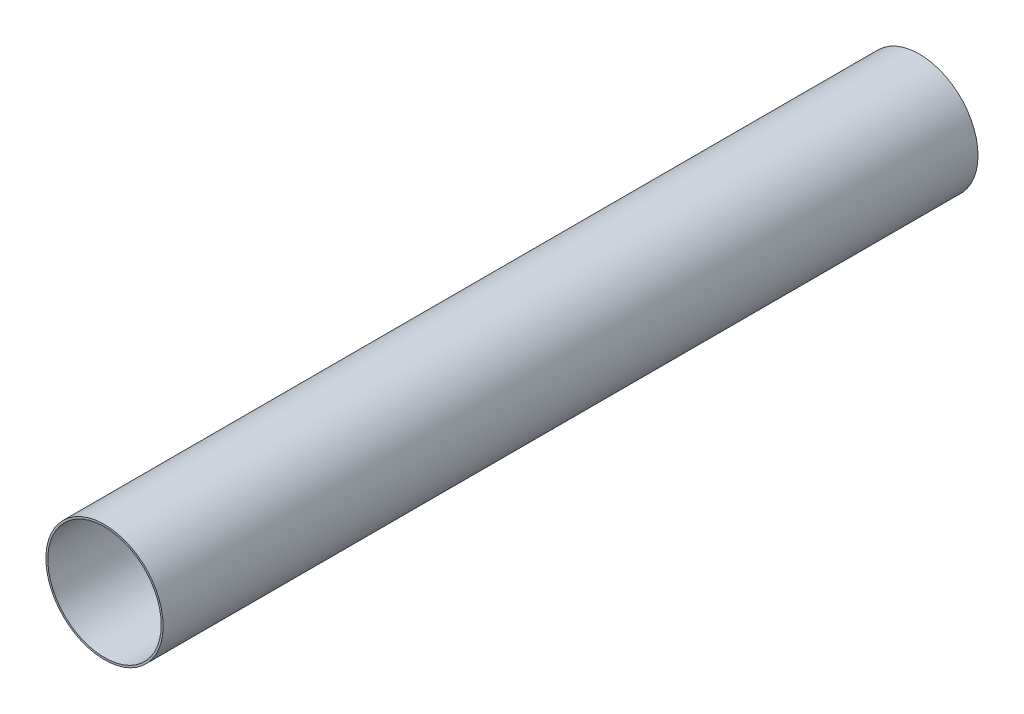
ISO-10303-21;
HEADER;
FILE_DESCRIPTION(('STEP AP214'),'2;1');
FILE_NAME('part.step','',(''),(''),'','','');
FILE_SCHEMA(('AUTOMOTIVE_DESIGN { 1 0 10303 214 1 1 1 1 }'));
ENDSEC;
DATA;
#1=APPLICATION_CONTEXT('core data for automotive mechanical design processes');
#2=APPLICATION_PROTOCOL_DEFINITION('international standard','automotive_design',2000,#1);
#3=PRODUCT_CONTEXT('',#1,'mechanical');
#4=PRODUCT('Part','Part','',(#3));
#5=PRODUCT_RELATED_PRODUCT_CATEGORY('part','',(#4));
#6=PRODUCT_DEFINITION_FORMATION('','',#4);
#7=PRODUCT_DEFINITION_CONTEXT('part definition',#1,'design');
#8=PRODUCT_DEFINITION('design','',#6,#7);
#9=PRODUCT_DEFINITION_SHAPE('','',#8);
#10=(LENGTH_UNIT() NAMED_UNIT(*) SI_UNIT(.MILLI.,.METRE.));
#11=(NAMED_UNIT(*) PLANE_ANGLE_UNIT() SI_UNIT($,.RADIAN.));
#12=(NAMED_UNIT(*) SI_UNIT($,.STERADIAN.) SOLID_ANGLE_UNIT());
#13=UNCERTAINTY_MEASURE_WITH_UNIT(LENGTH_MEASURE(1.E-05),#10,'distance_accuracy_value','');
#14=(GEOMETRIC_REPRESENTATION_CONTEXT(3) GLOBAL_UNCERTAINTY_ASSIGNED_CONTEXT((#13)) GLOBAL_UNIT_ASSIGNED_CONTEXT((#10,
#11,#12)) REPRESENTATION_CONTEXT('',''));
#15=CARTESIAN_POINT('',(0.,0.,0.));
#16=DIRECTION('',(0.,0.,1.));
#17=DIRECTION('',(1.,0.,0.));
#18=AXIS2_PLACEMENT_3D('',#15,#16,#17);
#19=CARTESIAN_POINT('',(0.,0.,-355.6));
#20=DIRECTION('',(0.,0.,1.));
#21=DIRECTION('',(1.,0.,0.));
#22=AXIS2_PLACEMENT_3D('',#19,#20,#21);
#23=CYLINDRICAL_SURFACE('',#22,51.15);
#24=CARTESIAN_POINT('',(0.,0.,-355.6));
#25=DIRECTION('',(0.,0.,1.));
#26=DIRECTION('',(1.,0.,0.));
#27=AXIS2_PLACEMENT_3D('',#24,#25,#26);
#28=CIRCLE('',#27,51.15);
#29=CARTESIAN_POINT('',(51.15,0.,-355.6));
#30=VERTEX_POINT('',#29);
#31=EDGE_CURVE('E10',#30,#30,#28,.T.);
#32=ORIENTED_EDGE('',*,*,#31,.T.);
#33=EDGE_LOOP('',(#32));
#34=FACE_BOUND('',#33,.T.);
#35=CARTESIAN_POINT('',(0.,0.,355.6));
#36=DIRECTION('',(0.,0.,1.));
#37=DIRECTION('',(1.,0.,0.));
#38=AXIS2_PLACEMENT_3D('',#35,#36,#37);
#39=CIRCLE('',#38,51.15);
#40=CARTESIAN_POINT('',(51.15,0.,355.6));
#41=VERTEX_POINT('',#40);
#42=EDGE_CURVE('E41',#41,#41,#39,.T.);
#43=ORIENTED_EDGE('',*,*,#42,.F.);
#44=EDGE_LOOP('',(#43));
#45=FACE_BOUND('',#44,.T.);
#46=ADVANCED_FACE('F31',(#34,#45),#23,.T.);
#47=CARTESIAN_POINT('',(0.,0.,-355.6));
#48=DIRECTION('',(0.,0.,1.));
#49=DIRECTION('',(1.,0.,0.));
#50=AXIS2_PLACEMENT_3D('',#47,#48,#49);
#51=PLANE('',#50);
#52=CARTESIAN_POINT('',(0.,0.,-355.6));
#53=DIRECTION('',(0.,0.,1.));
#54=DIRECTION('',(1.,0.,0.));
#55=AXIS2_PLACEMENT_3D('',#52,#53,#54);
#56=CIRCLE('',#55,49.5);
#57=CARTESIAN_POINT('',(49.5,0.,-355.6));
#58=VERTEX_POINT('',#57);
#59=EDGE_CURVE('E37',#58,#58,#56,.T.);
#60=ORIENTED_EDGE('',*,*,#59,.T.);
#61=EDGE_LOOP('',(#60));
#62=FACE_BOUND('',#61,.T.);
#63=ORIENTED_EDGE('',*,*,#31,.F.);
#64=EDGE_LOOP('',(#63));
#65=FACE_BOUND('',#64,.T.);
#66=ADVANCED_FACE('F60',(#62,#65),#51,.F.);
#67=CARTESIAN_POINT('',(0.,0.,-355.6));
#68=DIRECTION('',(0.,0.,1.));
#69=DIRECTION('',(1.,0.,0.));
#70=AXIS2_PLACEMENT_3D('',#67,#68,#69);
#71=CYLINDRICAL_SURFACE('',#70,49.5);
#72=ORIENTED_EDGE('',*,*,#59,.F.);
#73=EDGE_LOOP('',(#72));
#74=FACE_BOUND('',#73,.T.);
#75=CARTESIAN_POINT('',(0.,0.,355.6));
#76=DIRECTION('',(0.,0.,1.));
#77=DIRECTION('',(1.,0.,0.));
#78=AXIS2_PLACEMENT_3D('',#75,#76,#77);
#79=CIRCLE('',#78,49.5);
#80=CARTESIAN_POINT('',(49.5,0.,355.6));
#81=VERTEX_POINT('',#80);
#82=EDGE_CURVE('E45',#81,#81,#79,.T.);
#83=ORIENTED_EDGE('',*,*,#82,.T.);
#84=EDGE_LOOP('',(#83));
#85=FACE_BOUND('',#84,.T.);
#86=ADVANCED_FACE('F51',(#74,#85),#71,.F.);
#87=CARTESIAN_POINT('',(0.,0.,355.6));
#88=DIRECTION('',(0.,0.,1.));
#89=DIRECTION('',(1.,0.,0.));
#90=AXIS2_PLACEMENT_3D('',#87,#88,#89);
#91=PLANE('',#90);
#92=ORIENTED_EDGE('',*,*,#42,.T.);
#93=EDGE_LOOP('',(#92));
#94=FACE_BOUND('',#93,.T.);
#95=ORIENTED_EDGE('',*,*,#82,.F.);
#96=EDGE_LOOP('',(#95));
#97=FACE_BOUND('',#96,.T.);
#98=ADVANCED_FACE('F53',(#94,#97),#91,.T.);
#99=CLOSED_SHELL('',(#46,#66,#86,#98));
#100=MANIFOLD_SOLID_BREP('B2',#99);
#101=ADVANCED_BREP_SHAPE_REPRESENTATION('',(#18,#100),#14);
#102=SHAPE_DEFINITION_REPRESENTATION(#9,#101);
ENDSEC;
END-ISO-10303-21;
